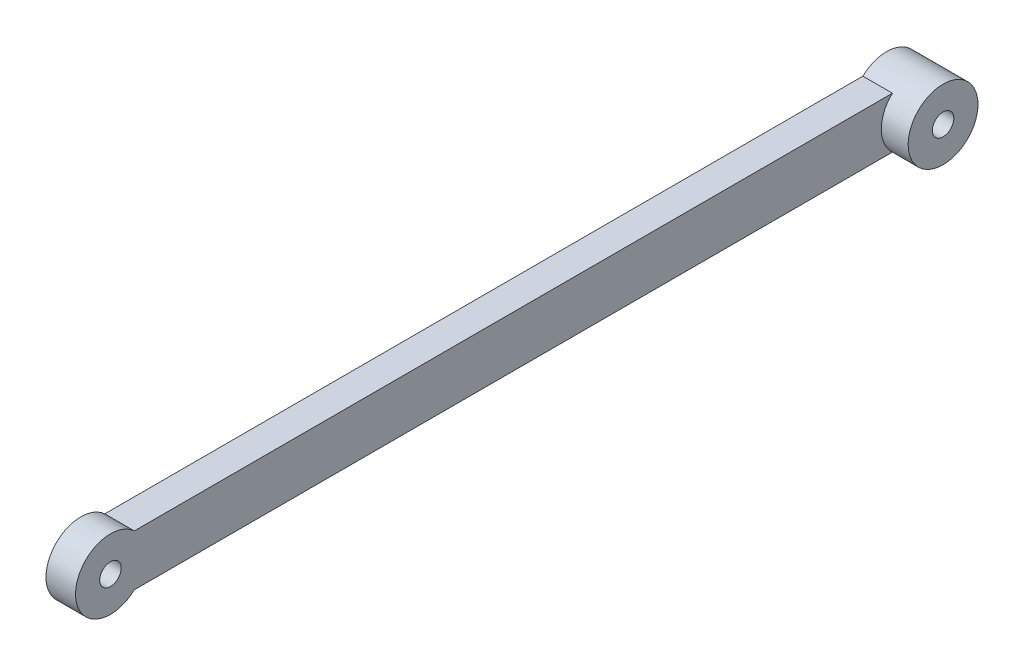
ISO-10303-21;
HEADER;
FILE_DESCRIPTION(('STEP AP214'),'2;1');
FILE_NAME('part.step','',(''),(''),'','','');
FILE_SCHEMA(('AUTOMOTIVE_DESIGN { 1 0 10303 214 1 1 1 1 }'));
ENDSEC;
DATA;
#1=APPLICATION_CONTEXT('core data for automotive mechanical design processes');
#2=APPLICATION_PROTOCOL_DEFINITION('international standard','automotive_design',2000,#1);
#3=PRODUCT_CONTEXT('',#1,'mechanical');
#4=PRODUCT('Part','Part','',(#3));
#5=PRODUCT_RELATED_PRODUCT_CATEGORY('part','',(#4));
#6=PRODUCT_DEFINITION_FORMATION('','',#4);
#7=PRODUCT_DEFINITION_CONTEXT('part definition',#1,'design');
#8=PRODUCT_DEFINITION('design','',#6,#7);
#9=PRODUCT_DEFINITION_SHAPE('','',#8);
#10=(LENGTH_UNIT() NAMED_UNIT(*) SI_UNIT(.MILLI.,.METRE.));
#11=(NAMED_UNIT(*) PLANE_ANGLE_UNIT() SI_UNIT($,.RADIAN.));
#12=(NAMED_UNIT(*) SI_UNIT($,.STERADIAN.) SOLID_ANGLE_UNIT());
#13=UNCERTAINTY_MEASURE_WITH_UNIT(LENGTH_MEASURE(1.E-05),#10,'distance_accuracy_value','');
#14=(GEOMETRIC_REPRESENTATION_CONTEXT(3) GLOBAL_UNCERTAINTY_ASSIGNED_CONTEXT((#13)) GLOBAL_UNIT_ASSIGNED_CONTEXT((#10,
#11,#12)) REPRESENTATION_CONTEXT('',''));
#15=CARTESIAN_POINT('',(0.,0.,0.));
#16=DIRECTION('',(0.,0.,1.));
#17=DIRECTION('',(1.,0.,0.));
#18=AXIS2_PLACEMENT_3D('',#15,#16,#17);
#19=CARTESIAN_POINT('',(5.5,0.,-150.));
#20=DIRECTION('',(1.,0.,0.));
#21=DIRECTION('',(0.,0.,-1.));
#22=AXIS2_PLACEMENT_3D('',#19,#20,#21);
#23=PLANE('',#22);
#24=CARTESIAN_POINT('',(5.5,0.,-150.));
#25=DIRECTION('',(1.,0.,0.));
#26=DIRECTION('',(0.,0.,-1.));
#27=AXIS2_PLACEMENT_3D('',#24,#25,#26);
#28=CIRCLE('',#27,6.50000000000002);
#29=CARTESIAN_POINT('',(5.5,4.75000000000003,-145.562940162675));
#30=VERTEX_POINT('',#29);
#31=CARTESIAN_POINT('',(5.5,-4.75,-145.562940162675));
#32=VERTEX_POINT('',#31);
#33=EDGE_CURVE('E85',#30,#32,#28,.T.);
#34=ORIENTED_EDGE('',*,*,#33,.F.);
#35=DIRECTION('',(0.,0.,1.));
#36=VECTOR('',#35,1.);
#37=CARTESIAN_POINT('',(5.5,4.75,-4.43705983732471));
#38=LINE('',#37,#36);
#39=CARTESIAN_POINT('',(5.5,4.75,-4.43705983732471));
#40=VERTEX_POINT('',#39);
#41=EDGE_CURVE('E77',#30,#40,#38,.T.);
#42=ORIENTED_EDGE('',*,*,#41,.T.);
#43=CARTESIAN_POINT('',(5.5,0.,0.));
#44=DIRECTION('',(1.,0.,0.));
#45=DIRECTION('',(0.,0.,-1.));
#46=AXIS2_PLACEMENT_3D('',#43,#44,#45);
#47=CIRCLE('',#46,6.5);
#48=CARTESIAN_POINT('',(5.5,-4.75,-4.43705983732471));
#49=VERTEX_POINT('',#48);
#50=EDGE_CURVE('E91',#40,#49,#47,.T.);
#51=ORIENTED_EDGE('',*,*,#50,.T.);
#52=DIRECTION('',(0.,0.,-1.));
#53=VECTOR('',#52,1.);
#54=CARTESIAN_POINT('',(5.5,-4.75,-4.43705983732471));
#55=LINE('',#54,#53);
#56=EDGE_CURVE('E50',#49,#32,#55,.T.);
#57=ORIENTED_EDGE('',*,*,#56,.T.);
#58=EDGE_LOOP('',(#34,#42,#51,#57));
#59=FACE_BOUND('',#58,.T.);
#60=CARTESIAN_POINT('',(5.5,0.,0.));
#61=DIRECTION('',(1.,0.,0.));
#62=DIRECTION('',(0.,0.,-1.));
#63=AXIS2_PLACEMENT_3D('',#60,#61,#62);
#64=CIRCLE('',#63,2.);
#65=CARTESIAN_POINT('',(5.5,0.,-2.));
#66=VERTEX_POINT('',#65);
#67=EDGE_CURVE('E106',#66,#66,#64,.T.);
#68=ORIENTED_EDGE('',*,*,#67,.F.);
#69=EDGE_LOOP('',(#68));
#70=FACE_BOUND('',#69,.T.);
#71=ADVANCED_FACE('F33',(#59,#70),#23,.T.);
#72=CARTESIAN_POINT('',(0.,0.,-150.));
#73=DIRECTION('',(1.,0.,0.));
#74=DIRECTION('',(0.,0.,-1.));
#75=AXIS2_PLACEMENT_3D('',#72,#73,#74);
#76=PLANE('',#75);
#77=CARTESIAN_POINT('',(0.,0.,-150.));
#78=DIRECTION('',(1.,0.,0.));
#79=DIRECTION('',(0.,0.,-1.));
#80=AXIS2_PLACEMENT_3D('',#77,#78,#79);
#81=CIRCLE('',#80,6.49999999999999);
#82=CARTESIAN_POINT('',(0.,-4.75,-145.562940162675));
#83=VERTEX_POINT('',#82);
#84=CARTESIAN_POINT('',(0.,4.75,-145.562940162675));
#85=VERTEX_POINT('',#84);
#86=EDGE_CURVE('E87',#83,#85,#81,.T.);
#87=ORIENTED_EDGE('',*,*,#86,.F.);
#88=DIRECTION('',(0.,0.,-1.));
#89=VECTOR('',#88,1.);
#90=CARTESIAN_POINT('',(0.,-4.75,-4.43705983732471));
#91=LINE('',#90,#89);
#92=CARTESIAN_POINT('',(0.,-4.75,-4.43705983732471));
#93=VERTEX_POINT('',#92);
#94=EDGE_CURVE('E73',#93,#83,#91,.T.);
#95=ORIENTED_EDGE('',*,*,#94,.F.);
#96=CARTESIAN_POINT('',(0.,0.,0.));
#97=DIRECTION('',(1.,0.,0.));
#98=DIRECTION('',(0.,0.,-1.));
#99=AXIS2_PLACEMENT_3D('',#96,#97,#98);
#100=CIRCLE('',#99,6.5);
#101=CARTESIAN_POINT('',(0.,4.75,-4.43705983732471));
#102=VERTEX_POINT('',#101);
#103=EDGE_CURVE('E68',#102,#93,#100,.T.);
#104=ORIENTED_EDGE('',*,*,#103,.F.);
#105=DIRECTION('',(0.,0.,1.));
#106=VECTOR('',#105,1.);
#107=CARTESIAN_POINT('',(0.,4.75,-4.43705983732471));
#108=LINE('',#107,#106);
#109=EDGE_CURVE('E115',#85,#102,#108,.T.);
#110=ORIENTED_EDGE('',*,*,#109,.F.);
#111=EDGE_LOOP('',(#87,#95,#104,#110));
#112=FACE_BOUND('',#111,.T.);
#113=CARTESIAN_POINT('',(0.,0.,0.));
#114=DIRECTION('',(1.,0.,0.));
#115=DIRECTION('',(0.,0.,-1.));
#116=AXIS2_PLACEMENT_3D('',#113,#114,#115);
#117=CIRCLE('',#116,2.);
#118=CARTESIAN_POINT('',(0.,0.,-2.));
#119=VERTEX_POINT('',#118);
#120=EDGE_CURVE('E105',#119,#119,#117,.T.);
#121=ORIENTED_EDGE('',*,*,#120,.T.);
#122=EDGE_LOOP('',(#121));
#123=FACE_BOUND('',#122,.T.);
#124=CARTESIAN_POINT('',(0.,0.,-150.));
#125=DIRECTION('',(1.,0.,0.));
#126=DIRECTION('',(0.,0.,-1.));
#127=AXIS2_PLACEMENT_3D('',#124,#125,#126);
#128=CIRCLE('',#127,2.);
#129=CARTESIAN_POINT('',(0.,0.,-152.));
#130=VERTEX_POINT('',#129);
#131=EDGE_CURVE('E98',#130,#130,#128,.T.);
#132=ORIENTED_EDGE('',*,*,#131,.T.);
#133=EDGE_LOOP('',(#132));
#134=FACE_BOUND('',#133,.T.);
#135=ADVANCED_FACE('F123',(#112,#123,#134),#76,.F.);
#136=CARTESIAN_POINT('',(5.5,0.,-150.));
#137=DIRECTION('',(-1.,0.,0.));
#138=DIRECTION('',(0.,0.,1.));
#139=AXIS2_PLACEMENT_3D('',#136,#137,#138);
#140=CYLINDRICAL_SURFACE('',#139,6.49999999999999);
#141=ORIENTED_EDGE('',*,*,#86,.T.);
#142=DIRECTION('',(-1.,0.,0.));
#143=VECTOR('',#142,1.);
#144=CARTESIAN_POINT('',(5.5,4.75,-145.562940162675));
#145=LINE('',#144,#143);
#146=EDGE_CURVE('E11',#30,#85,#145,.T.);
#147=ORIENTED_EDGE('',*,*,#146,.F.);
#148=ORIENTED_EDGE('',*,*,#33,.T.);
#149=DIRECTION('',(-1.,0.,0.));
#150=VECTOR('',#149,1.);
#151=CARTESIAN_POINT('',(5.5,-4.75,-145.562940162675));
#152=LINE('',#151,#150);
#153=EDGE_CURVE('E113',#32,#83,#152,.T.);
#154=ORIENTED_EDGE('',*,*,#153,.T.);
#155=EDGE_LOOP('',(#141,#147,#148,#154));
#156=FACE_BOUND('',#155,.T.);
#157=CARTESIAN_POINT('',(10.5,0.,-150.));
#158=DIRECTION('',(1.,0.,0.));
#159=DIRECTION('',(0.,0.,-1.));
#160=AXIS2_PLACEMENT_3D('',#157,#158,#159);
#161=CIRCLE('',#160,6.50000000000002);
#162=CARTESIAN_POINT('',(10.5,0.,-156.5));
#163=VERTEX_POINT('',#162);
#164=EDGE_CURVE('E94',#163,#163,#161,.T.);
#165=ORIENTED_EDGE('',*,*,#164,.F.);
#166=EDGE_LOOP('',(#165));
#167=FACE_BOUND('',#166,.T.);
#168=ADVANCED_FACE('F35',(#156,#167),#140,.T.);
#169=CARTESIAN_POINT('',(5.5,4.75,-4.43705983732471));
#170=DIRECTION('',(0.,-1.,0.));
#171=DIRECTION('',(0.,0.,-1.));
#172=AXIS2_PLACEMENT_3D('',#169,#170,#171);
#173=PLANE('',#172);
#174=ORIENTED_EDGE('',*,*,#109,.T.);
#175=DIRECTION('',(-1.,0.,0.));
#176=VECTOR('',#175,1.);
#177=CARTESIAN_POINT('',(5.5,4.75,-4.43705983732471));
#178=LINE('',#177,#176);
#179=EDGE_CURVE('E42',#40,#102,#178,.T.);
#180=ORIENTED_EDGE('',*,*,#179,.F.);
#181=ORIENTED_EDGE('',*,*,#41,.F.);
#182=ORIENTED_EDGE('',*,*,#146,.T.);
#183=EDGE_LOOP('',(#174,#180,#181,#182));
#184=FACE_BOUND('',#183,.T.);
#185=ADVANCED_FACE('F89',(#184),#173,.F.);
#186=CARTESIAN_POINT('',(5.5,0.,0.));
#187=DIRECTION('',(-1.,0.,0.));
#188=DIRECTION('',(0.,0.,1.));
#189=AXIS2_PLACEMENT_3D('',#186,#187,#188);
#190=CYLINDRICAL_SURFACE('',#189,6.5);
#191=ORIENTED_EDGE('',*,*,#103,.T.);
#192=DIRECTION('',(-1.,0.,0.));
#193=VECTOR('',#192,1.);
#194=CARTESIAN_POINT('',(5.5,-4.75,-4.43705983732471));
#195=LINE('',#194,#193);
#196=EDGE_CURVE('E120',#49,#93,#195,.T.);
#197=ORIENTED_EDGE('',*,*,#196,.F.);
#198=ORIENTED_EDGE('',*,*,#50,.F.);
#199=ORIENTED_EDGE('',*,*,#179,.T.);
#200=EDGE_LOOP('',(#191,#197,#198,#199));
#201=FACE_BOUND('',#200,.T.);
#202=ADVANCED_FACE('F121',(#201),#190,.T.);
#203=CARTESIAN_POINT('',(5.5,-4.75,-4.43705983732471));
#204=DIRECTION('',(0.,1.,0.));
#205=DIRECTION('',(0.,0.,1.));
#206=AXIS2_PLACEMENT_3D('',#203,#204,#205);
#207=PLANE('',#206);
#208=ORIENTED_EDGE('',*,*,#94,.T.);
#209=ORIENTED_EDGE('',*,*,#153,.F.);
#210=ORIENTED_EDGE('',*,*,#56,.F.);
#211=ORIENTED_EDGE('',*,*,#196,.T.);
#212=EDGE_LOOP('',(#208,#209,#210,#211));
#213=FACE_BOUND('',#212,.T.);
#214=ADVANCED_FACE('F150',(#213),#207,.F.);
#215=CARTESIAN_POINT('',(5.5,0.,0.));
#216=DIRECTION('',(-1.,0.,0.));
#217=DIRECTION('',(0.,0.,1.));
#218=AXIS2_PLACEMENT_3D('',#215,#216,#217);
#219=CYLINDRICAL_SURFACE('',#218,2.);
#220=ORIENTED_EDGE('',*,*,#67,.T.);
#221=EDGE_LOOP('',(#220));
#222=FACE_BOUND('',#221,.T.);
#223=ORIENTED_EDGE('',*,*,#120,.F.);
#224=EDGE_LOOP('',(#223));
#225=FACE_BOUND('',#224,.T.);
#226=ADVANCED_FACE('F135',(#222,#225),#219,.F.);
#227=CARTESIAN_POINT('',(5.5,0.,-150.));
#228=DIRECTION('',(-1.,0.,0.));
#229=DIRECTION('',(0.,0.,1.));
#230=AXIS2_PLACEMENT_3D('',#227,#228,#229);
#231=CYLINDRICAL_SURFACE('',#230,2.);
#232=ORIENTED_EDGE('',*,*,#131,.F.);
#233=EDGE_LOOP('',(#232));
#234=FACE_BOUND('',#233,.T.);
#235=CARTESIAN_POINT('',(10.5,0.,-150.));
#236=DIRECTION('',(1.,0.,0.));
#237=DIRECTION('',(0.,0.,-1.));
#238=AXIS2_PLACEMENT_3D('',#235,#236,#237);
#239=CIRCLE('',#238,2.);
#240=CARTESIAN_POINT('',(10.5,0.,-152.));
#241=VERTEX_POINT('',#240);
#242=EDGE_CURVE('E95',#241,#241,#239,.T.);
#243=ORIENTED_EDGE('',*,*,#242,.T.);
#244=EDGE_LOOP('',(#243));
#245=FACE_BOUND('',#244,.T.);
#246=ADVANCED_FACE('F131',(#234,#245),#231,.F.);
#247=CARTESIAN_POINT('',(10.5,0.,-150.));
#248=DIRECTION('',(1.,0.,0.));
#249=DIRECTION('',(0.,0.,-1.));
#250=AXIS2_PLACEMENT_3D('',#247,#248,#249);
#251=PLANE('',#250);
#252=ORIENTED_EDGE('',*,*,#164,.T.);
#253=EDGE_LOOP('',(#252));
#254=FACE_BOUND('',#253,.T.);
#255=ORIENTED_EDGE('',*,*,#242,.F.);
#256=EDGE_LOOP('',(#255));
#257=FACE_BOUND('',#256,.T.);
#258=ADVANCED_FACE('F134',(#254,#257),#251,.T.);
#259=CLOSED_SHELL('',(#71,#135,#168,#185,#202,#214,#226,#246,#258));
#260=MANIFOLD_SOLID_BREP('B2',#259);
#261=ADVANCED_BREP_SHAPE_REPRESENTATION('',(#18,#260),#14);
#262=SHAPE_DEFINITION_REPRESENTATION(#9,#261);
ENDSEC;
END-ISO-10303-21;
